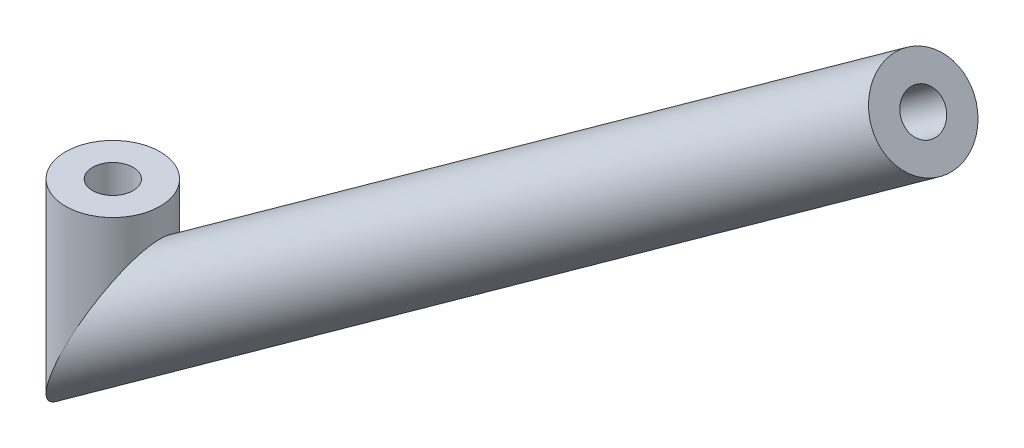
ISO-10303-21;
HEADER;
FILE_DESCRIPTION(('STEP AP214'),'2;1');
FILE_NAME('part.step','',(''),(''),'','','');
FILE_SCHEMA(('AUTOMOTIVE_DESIGN { 1 0 10303 214 1 1 1 1 }'));
ENDSEC;
DATA;
#1=APPLICATION_CONTEXT('core data for automotive mechanical design processes');
#2=APPLICATION_PROTOCOL_DEFINITION('international standard','automotive_design',2000,#1);
#3=PRODUCT_CONTEXT('',#1,'mechanical');
#4=PRODUCT('Part','Part','',(#3));
#5=PRODUCT_RELATED_PRODUCT_CATEGORY('part','',(#4));
#6=PRODUCT_DEFINITION_FORMATION('','',#4);
#7=PRODUCT_DEFINITION_CONTEXT('part definition',#1,'design');
#8=PRODUCT_DEFINITION('design','',#6,#7);
#9=PRODUCT_DEFINITION_SHAPE('','',#8);
#10=(LENGTH_UNIT() NAMED_UNIT(*) SI_UNIT(.MILLI.,.METRE.));
#11=(NAMED_UNIT(*) PLANE_ANGLE_UNIT() SI_UNIT($,.RADIAN.));
#12=(NAMED_UNIT(*) SI_UNIT($,.STERADIAN.) SOLID_ANGLE_UNIT());
#13=UNCERTAINTY_MEASURE_WITH_UNIT(LENGTH_MEASURE(1.E-05),#10,'distance_accuracy_value','');
#14=(GEOMETRIC_REPRESENTATION_CONTEXT(3) GLOBAL_UNCERTAINTY_ASSIGNED_CONTEXT((#13)) GLOBAL_UNIT_ASSIGNED_CONTEXT((#10,
#11,#12)) REPRESENTATION_CONTEXT('',''));
#15=CARTESIAN_POINT('',(0.,0.,0.));
#16=DIRECTION('',(0.,0.,1.));
#17=DIRECTION('',(1.,0.,0.));
#18=AXIS2_PLACEMENT_3D('',#15,#16,#17);
#19=CARTESIAN_POINT('',(0.179079417397742,20.,0.));
#20=DIRECTION('',(0.,-1.,0.));
#21=DIRECTION('',(0.,0.,-1.));
#22=AXIS2_PLACEMENT_3D('',#19,#20,#21);
#23=PLANE('',#22);
#24=CARTESIAN_POINT('',(0.179079417397742,20.,0.));
#25=DIRECTION('',(0.,-1.,0.));
#26=DIRECTION('',(0.,0.,-1.));
#27=AXIS2_PLACEMENT_3D('',#24,#25,#26);
#28=CIRCLE('',#27,1.5);
#29=CARTESIAN_POINT('',(0.179079417397742,20.,-1.5));
#30=VERTEX_POINT('',#29);
#31=EDGE_CURVE('E51',#30,#30,#28,.T.);
#32=ORIENTED_EDGE('',*,*,#31,.T.);
#33=EDGE_LOOP('',(#32));
#34=FACE_BOUND('',#33,.T.);
#35=CARTESIAN_POINT('',(0.179079417397742,20.,0.));
#36=DIRECTION('',(0.,-1.,0.));
#37=DIRECTION('',(0.,0.,-1.));
#38=AXIS2_PLACEMENT_3D('',#35,#36,#37);
#39=CIRCLE('',#38,3.5);
#40=CARTESIAN_POINT('',(0.179079417397742,20.,-3.5));
#41=VERTEX_POINT('',#40);
#42=EDGE_CURVE('E49',#41,#41,#39,.T.);
#43=ORIENTED_EDGE('',*,*,#42,.F.);
#44=EDGE_LOOP('',(#43));
#45=FACE_BOUND('',#44,.T.);
#46=ADVANCED_FACE('F37',(#34,#45),#23,.F.);
#47=CARTESIAN_POINT('',(60.2019762591226,54.306663616444,0.));
#48=DIRECTION('',(0.811422148641458,0.584460517652031,0.));
#49=DIRECTION('',(0.,0.,-1.));
#50=AXIS2_PLACEMENT_3D('',#47,#48,#49);
#51=PLANE('',#50);
#52=CARTESIAN_POINT('',(60.2019762591226,54.306663616444,0.));
#53=DIRECTION('',(0.811422148641458,0.584460517652031,0.));
#54=DIRECTION('',(0.,0.,-1.));
#55=AXIS2_PLACEMENT_3D('',#52,#53,#54);
#56=CIRCLE('',#55,1.5);
#57=CARTESIAN_POINT('',(60.2019762591226,54.306663616444,-1.5));
#58=VERTEX_POINT('',#57);
#59=EDGE_CURVE('E58',#58,#58,#56,.T.);
#60=ORIENTED_EDGE('',*,*,#59,.F.);
#61=EDGE_LOOP('',(#60));
#62=FACE_BOUND('',#61,.T.);
#63=CARTESIAN_POINT('',(60.2019762591226,54.306663616444,0.));
#64=DIRECTION('',(0.811422148641458,0.584460517652031,0.));
#65=DIRECTION('',(-0.584460517652031,0.811422148641458,0.));
#66=AXIS2_PLACEMENT_3D('',#63,#64,#65);
#67=CIRCLE('',#66,3.5);
#68=CARTESIAN_POINT('',(58.1563644473405,57.1466411366891,0.));
#69=VERTEX_POINT('',#68);
#70=EDGE_CURVE('E41',#69,#69,#67,.T.);
#71=ORIENTED_EDGE('',*,*,#70,.T.);
#72=EDGE_LOOP('',(#71));
#73=FACE_BOUND('',#72,.T.);
#74=ADVANCED_FACE('F83',(#62,#73),#51,.T.);
#75=CARTESIAN_POINT('',(0.179079417397742,4.52878246071,0.));
#76=DIRECTION('',(0.,1.,0.));
#77=DIRECTION('',(0.,0.,1.));
#78=AXIS2_PLACEMENT_3D('',#75,#76,#77);
#79=CYLINDRICAL_SURFACE('',#78,3.5);
#80=CARTESIAN_POINT('',(0.179079417397741,11.0726781776386,0.));
#81=DIRECTION('',(-0.890073176107457,0.455817662200561,0.));
#82=DIRECTION('',(0.455817662200561,0.890073176107457,0.));
#83=AXIS2_PLACEMENT_3D('',#80,#81,#82);
#84=ELLIPSE('',#83,7.6785089526873,3.5);
#85=CARTESIAN_POINT('',(3.67907941739774,17.9071130289265,0.));
#86=VERTEX_POINT('',#85);
#87=EDGE_CURVE('E11',#86,#86,#84,.T.);
#88=ORIENTED_EDGE('',*,*,#87,.T.);
#89=EDGE_LOOP('',(#88));
#90=FACE_BOUND('',#89,.T.);
#91=ORIENTED_EDGE('',*,*,#42,.T.);
#92=EDGE_LOOP('',(#91));
#93=FACE_BOUND('',#92,.T.);
#94=ADVANCED_FACE('F80',(#90,#93),#79,.T.);
#95=CARTESIAN_POINT('',(60.2019762591226,54.306663616444,0.));
#96=DIRECTION('',(-0.811422148641458,-0.584460517652031,0.));
#97=DIRECTION('',(0.584460517652031,-0.811422148641458,0.));
#98=AXIS2_PLACEMENT_3D('',#95,#96,#97);
#99=CYLINDRICAL_SURFACE('',#98,3.5);
#100=ORIENTED_EDGE('',*,*,#70,.F.);
#101=EDGE_LOOP('',(#100));
#102=FACE_BOUND('',#101,.T.);
#103=ORIENTED_EDGE('',*,*,#87,.F.);
#104=EDGE_LOOP('',(#103));
#105=FACE_BOUND('',#104,.T.);
#106=ADVANCED_FACE('F39',(#102,#105),#99,.T.);
#107=CARTESIAN_POINT('',(0.179079417397742,4.52878246071,0.));
#108=DIRECTION('',(0.,1.,0.));
#109=DIRECTION('',(0.,0.,1.));
#110=AXIS2_PLACEMENT_3D('',#107,#108,#109);
#111=CYLINDRICAL_SURFACE('',#110,1.5);
#112=CARTESIAN_POINT('',(0.17907941739774,11.0726781776386,0.));
#113=DIRECTION('',(-0.890073176107457,0.455817662200561,0.));
#114=DIRECTION('',(-0.455817662200561,-0.890073176107457,0.));
#115=AXIS2_PLACEMENT_3D('',#112,#113,#114);
#116=ELLIPSE('',#115,3.2907895511517,1.5);
#117=CARTESIAN_POINT('',(-1.32092058260226,8.1436346699438,0.));
#118=VERTEX_POINT('',#117);
#119=EDGE_CURVE('E54',#118,#118,#116,.T.);
#120=ORIENTED_EDGE('',*,*,#119,.F.);
#121=EDGE_LOOP('',(#120));
#122=FACE_BOUND('',#121,.T.);
#123=ORIENTED_EDGE('',*,*,#31,.F.);
#124=EDGE_LOOP('',(#123));
#125=FACE_BOUND('',#124,.T.);
#126=ADVANCED_FACE('F70',(#122,#125),#111,.F.);
#127=CARTESIAN_POINT('',(60.2019762591226,54.306663616444,0.));
#128=DIRECTION('',(-0.811422148641458,-0.584460517652031,0.));
#129=DIRECTION('',(0.584460517652031,-0.811422148641458,0.));
#130=AXIS2_PLACEMENT_3D('',#127,#128,#129);
#131=CYLINDRICAL_SURFACE('',#130,1.5);
#132=ORIENTED_EDGE('',*,*,#59,.T.);
#133=EDGE_LOOP('',(#132));
#134=FACE_BOUND('',#133,.T.);
#135=ORIENTED_EDGE('',*,*,#119,.T.);
#136=EDGE_LOOP('',(#135));
#137=FACE_BOUND('',#136,.T.);
#138=ADVANCED_FACE('F72',(#134,#137),#131,.F.);
#139=CLOSED_SHELL('',(#46,#74,#94,#106,#126,#138));
#140=MANIFOLD_SOLID_BREP('B2',#139);
#141=ADVANCED_BREP_SHAPE_REPRESENTATION('',(#18,#140),#14);
#142=SHAPE_DEFINITION_REPRESENTATION(#9,#141);
ENDSEC;
END-ISO-10303-21;
